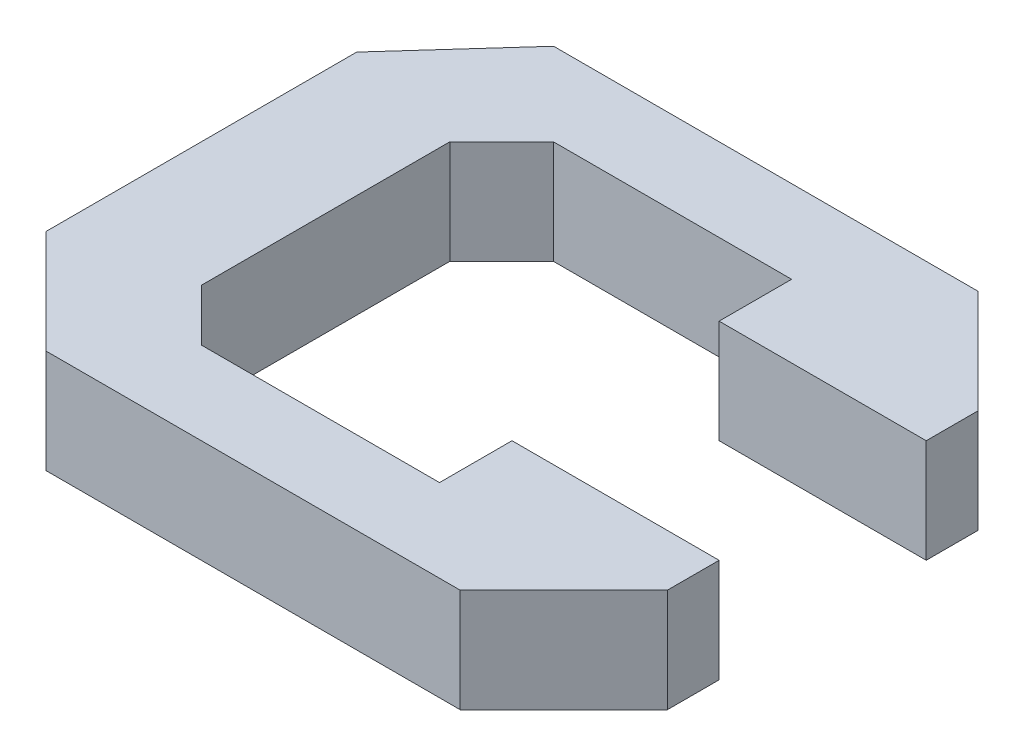
ISO-10303-21;
HEADER;
FILE_DESCRIPTION(('STEP AP214'),'2;1');
FILE_NAME('part.step','',(''),(''),'','','');
FILE_SCHEMA(('AUTOMOTIVE_DESIGN { 1 0 10303 214 1 1 1 1 }'));
ENDSEC;
DATA;
#1=APPLICATION_CONTEXT('core data for automotive mechanical design processes');
#2=APPLICATION_PROTOCOL_DEFINITION('international standard','automotive_design',2000,#1);
#3=PRODUCT_CONTEXT('',#1,'mechanical');
#4=PRODUCT('Part','Part','',(#3));
#5=PRODUCT_RELATED_PRODUCT_CATEGORY('part','',(#4));
#6=PRODUCT_DEFINITION_FORMATION('','',#4);
#7=PRODUCT_DEFINITION_CONTEXT('part definition',#1,'design');
#8=PRODUCT_DEFINITION('design','',#6,#7);
#9=PRODUCT_DEFINITION_SHAPE('','',#8);
#10=(LENGTH_UNIT() NAMED_UNIT(*) SI_UNIT(.MILLI.,.METRE.));
#11=(NAMED_UNIT(*) PLANE_ANGLE_UNIT() SI_UNIT($,.RADIAN.));
#12=(NAMED_UNIT(*) SI_UNIT($,.STERADIAN.) SOLID_ANGLE_UNIT());
#13=UNCERTAINTY_MEASURE_WITH_UNIT(LENGTH_MEASURE(1.E-05),#10,'distance_accuracy_value','');
#14=(GEOMETRIC_REPRESENTATION_CONTEXT(3) GLOBAL_UNCERTAINTY_ASSIGNED_CONTEXT((#13)) GLOBAL_UNIT_ASSIGNED_CONTEXT((#10,
#11,#12)) REPRESENTATION_CONTEXT('',''));
#15=CARTESIAN_POINT('',(0.,0.,0.));
#16=DIRECTION('',(0.,0.,1.));
#17=DIRECTION('',(1.,0.,0.));
#18=AXIS2_PLACEMENT_3D('',#15,#16,#17);
#19=CARTESIAN_POINT('',(0.,6.35,0.));
#20=DIRECTION('',(-1.,0.,0.));
#21=DIRECTION('',(0.,0.,1.));
#22=AXIS2_PLACEMENT_3D('',#19,#20,#21);
#23=PLANE('',#22);
#24=DIRECTION('',(0.,1.,0.));
#25=VECTOR('',#24,1.);
#26=CARTESIAN_POINT('',(0.,0.,-25.4));
#27=LINE('',#26,#25);
#28=CARTESIAN_POINT('',(0.,0.,-25.4));
#29=VERTEX_POINT('',#28);
#30=CARTESIAN_POINT('',(0.,6.35,-25.4));
#31=VERTEX_POINT('',#30);
#32=EDGE_CURVE('E265',#29,#31,#27,.T.);
#33=ORIENTED_EDGE('',*,*,#32,.T.);
#34=DIRECTION('',(0.,0.,-1.));
#35=VECTOR('',#34,1.);
#36=CARTESIAN_POINT('',(0.,6.35,0.));
#37=LINE('',#36,#35);
#38=CARTESIAN_POINT('',(0.,6.35,-22.225));
#39=VERTEX_POINT('',#38);
#40=EDGE_CURVE('E349',#39,#31,#37,.T.);
#41=ORIENTED_EDGE('',*,*,#40,.F.);
#42=DIRECTION('',(0.,1.,0.));
#43=VECTOR('',#42,1.);
#44=CARTESIAN_POINT('',(0.,0.,-22.225));
#45=LINE('',#44,#43);
#46=CARTESIAN_POINT('',(0.,0.,-22.225));
#47=VERTEX_POINT('',#46);
#48=EDGE_CURVE('E335',#47,#39,#45,.T.);
#49=ORIENTED_EDGE('',*,*,#48,.F.);
#50=DIRECTION('',(0.,0.,-1.));
#51=VECTOR('',#50,1.);
#52=CARTESIAN_POINT('',(0.,0.,0.));
#53=LINE('',#52,#51);
#54=EDGE_CURVE('E330',#47,#29,#53,.T.);
#55=ORIENTED_EDGE('',*,*,#54,.T.);
#56=EDGE_LOOP('',(#33,#41,#49,#55));
#57=FACE_BOUND('',#56,.T.);
#58=ADVANCED_FACE('F111',(#57),#23,.F.);
#59=DIRECTION('',(0.,1.,0.));
#60=VECTOR('',#59,1.);
#61=CARTESIAN_POINT('',(0.,0.,-6.35000000000002));
#62=LINE('',#61,#60);
#63=CARTESIAN_POINT('',(0.,0.,-6.35000000000002));
#64=VERTEX_POINT('',#63);
#65=CARTESIAN_POINT('',(0.,6.35,-6.35000000000002));
#66=VERTEX_POINT('',#65);
#67=EDGE_CURVE('E242',#64,#66,#62,.T.);
#68=ORIENTED_EDGE('',*,*,#67,.F.);
#69=CARTESIAN_POINT('',(0.,0.,-9.525));
#70=VERTEX_POINT('',#69);
#71=EDGE_CURVE('E359',#64,#70,#53,.T.);
#72=ORIENTED_EDGE('',*,*,#71,.T.);
#73=DIRECTION('',(0.,1.,0.));
#74=VECTOR('',#73,1.);
#75=CARTESIAN_POINT('',(0.,0.,-9.525));
#76=LINE('',#75,#74);
#77=CARTESIAN_POINT('',(0.,6.35,-9.525));
#78=VERTEX_POINT('',#77);
#79=EDGE_CURVE('E337',#70,#78,#76,.T.);
#80=ORIENTED_EDGE('',*,*,#79,.T.);
#81=EDGE_CURVE('E352',#66,#78,#37,.T.);
#82=ORIENTED_EDGE('',*,*,#81,.F.);
#83=EDGE_LOOP('',(#68,#72,#80,#82));
#84=FACE_BOUND('',#83,.T.);
#85=ADVANCED_FACE('F383',(#84),#23,.F.);
#86=CARTESIAN_POINT('',(0.,6.35,-31.75));
#87=DIRECTION('',(0.,0.,1.));
#88=DIRECTION('',(1.,0.,0.));
#89=AXIS2_PLACEMENT_3D('',#86,#87,#88);
#90=PLANE('',#89);
#91=DIRECTION('',(-1.,0.,0.));
#92=VECTOR('',#91,1.);
#93=CARTESIAN_POINT('',(0.,0.,-31.75));
#94=LINE('',#93,#92);
#95=CARTESIAN_POINT('',(-6.35,0.,-31.75));
#96=VERTEX_POINT('',#95);
#97=CARTESIAN_POINT('',(-32.3716200335261,0.,-31.75));
#98=VERTEX_POINT('',#97);
#99=EDGE_CURVE('E360',#96,#98,#94,.T.);
#100=ORIENTED_EDGE('',*,*,#99,.T.);
#101=DIRECTION('',(0.,1.,0.));
#102=VECTOR('',#101,1.);
#103=CARTESIAN_POINT('',(-32.3716200335261,0.,-31.75));
#104=LINE('',#103,#102);
#105=CARTESIAN_POINT('',(-32.3716200335261,6.35,-31.75));
#106=VERTEX_POINT('',#105);
#107=EDGE_CURVE('E135',#98,#106,#104,.T.);
#108=ORIENTED_EDGE('',*,*,#107,.T.);
#109=DIRECTION('',(-1.,0.,0.));
#110=VECTOR('',#109,1.);
#111=CARTESIAN_POINT('',(0.,6.35,-31.75));
#112=LINE('',#111,#110);
#113=CARTESIAN_POINT('',(-6.35,6.35,-31.75));
#114=VERTEX_POINT('',#113);
#115=EDGE_CURVE('E353',#114,#106,#112,.T.);
#116=ORIENTED_EDGE('',*,*,#115,.F.);
#117=DIRECTION('',(0.,1.,0.));
#118=VECTOR('',#117,1.);
#119=CARTESIAN_POINT('',(-6.35,0.,-31.75));
#120=LINE('',#119,#118);
#121=EDGE_CURVE('E269',#96,#114,#120,.T.);
#122=ORIENTED_EDGE('',*,*,#121,.F.);
#123=EDGE_LOOP('',(#100,#108,#116,#122));
#124=FACE_BOUND('',#123,.T.);
#125=ADVANCED_FACE('F431',(#124),#90,.F.);
#126=CARTESIAN_POINT('',(-38.1,6.35,0.));
#127=DIRECTION('',(1.,0.,0.));
#128=DIRECTION('',(0.,0.,-1.));
#129=AXIS2_PLACEMENT_3D('',#126,#127,#128);
#130=PLANE('',#129);
#131=DIRECTION('',(0.,0.,1.));
#132=VECTOR('',#131,1.);
#133=CARTESIAN_POINT('',(-38.1,6.35,0.));
#134=LINE('',#133,#132);
#135=CARTESIAN_POINT('',(-38.1,6.35,-25.4));
#136=VERTEX_POINT('',#135);
#137=CARTESIAN_POINT('',(-38.1,6.35,-6.35));
#138=VERTEX_POINT('',#137);
#139=EDGE_CURVE('E119',#136,#138,#134,.T.);
#140=ORIENTED_EDGE('',*,*,#139,.F.);
#141=DIRECTION('',(0.,1.,0.));
#142=VECTOR('',#141,1.);
#143=CARTESIAN_POINT('',(-38.1,0.,-25.4));
#144=LINE('',#143,#142);
#145=CARTESIAN_POINT('',(-38.1,0.,-25.4));
#146=VERTEX_POINT('',#145);
#147=EDGE_CURVE('E276',#146,#136,#144,.T.);
#148=ORIENTED_EDGE('',*,*,#147,.F.);
#149=DIRECTION('',(0.,0.,1.));
#150=VECTOR('',#149,1.);
#151=CARTESIAN_POINT('',(-38.1,0.,0.));
#152=LINE('',#151,#150);
#153=CARTESIAN_POINT('',(-38.1,0.,-6.34999999999999));
#154=VERTEX_POINT('',#153);
#155=EDGE_CURVE('E362',#146,#154,#152,.T.);
#156=ORIENTED_EDGE('',*,*,#155,.T.);
#157=DIRECTION('',(0.,1.,0.));
#158=VECTOR('',#157,1.);
#159=CARTESIAN_POINT('',(-38.1,0.,-6.35));
#160=LINE('',#159,#158);
#161=EDGE_CURVE('E282',#154,#138,#160,.T.);
#162=ORIENTED_EDGE('',*,*,#161,.T.);
#163=EDGE_LOOP('',(#140,#148,#156,#162));
#164=FACE_BOUND('',#163,.T.);
#165=ADVANCED_FACE('F367',(#164),#130,.F.);
#166=CARTESIAN_POINT('',(0.,6.35,0.));
#167=DIRECTION('',(0.,0.,-1.));
#168=DIRECTION('',(-1.,0.,0.));
#169=AXIS2_PLACEMENT_3D('',#166,#167,#168);
#170=PLANE('',#169);
#171=DIRECTION('',(0.,1.,0.));
#172=VECTOR('',#171,1.);
#173=CARTESIAN_POINT('',(-31.75,0.,0.));
#174=LINE('',#173,#172);
#175=CARTESIAN_POINT('',(-31.75,0.,0.));
#176=VERTEX_POINT('',#175);
#177=CARTESIAN_POINT('',(-31.75,6.35,0.));
#178=VERTEX_POINT('',#177);
#179=EDGE_CURVE('E271',#176,#178,#174,.T.);
#180=ORIENTED_EDGE('',*,*,#179,.F.);
#181=DIRECTION('',(1.,0.,0.));
#182=VECTOR('',#181,1.);
#183=CARTESIAN_POINT('',(0.,0.,0.));
#184=LINE('',#183,#182);
#185=CARTESIAN_POINT('',(-6.35,0.,0.));
#186=VERTEX_POINT('',#185);
#187=EDGE_CURVE('E114',#176,#186,#184,.T.);
#188=ORIENTED_EDGE('',*,*,#187,.T.);
#189=DIRECTION('',(0.,1.,0.));
#190=VECTOR('',#189,1.);
#191=CARTESIAN_POINT('',(-6.35,0.,0.));
#192=LINE('',#191,#190);
#193=CARTESIAN_POINT('',(-6.35,6.35,0.));
#194=VERTEX_POINT('',#193);
#195=EDGE_CURVE('E239',#186,#194,#192,.T.);
#196=ORIENTED_EDGE('',*,*,#195,.T.);
#197=DIRECTION('',(1.,0.,0.));
#198=VECTOR('',#197,1.);
#199=CARTESIAN_POINT('',(0.,6.35,0.));
#200=LINE('',#199,#198);
#201=EDGE_CURVE('E12',#178,#194,#200,.T.);
#202=ORIENTED_EDGE('',*,*,#201,.F.);
#203=EDGE_LOOP('',(#180,#188,#196,#202));
#204=FACE_BOUND('',#203,.T.);
#205=ADVANCED_FACE('F253',(#204),#170,.F.);
#206=CARTESIAN_POINT('',(0.,6.35,0.));
#207=DIRECTION('',(0.,1.,0.));
#208=DIRECTION('',(0.,0.,1.));
#209=AXIS2_PLACEMENT_3D('',#206,#207,#208);
#210=PLANE('',#209);
#211=DIRECTION('',(0.669828666550268,0.,-0.74251569509842));
#212=VECTOR('',#211,1.);
#213=CARTESIAN_POINT('',(-38.1,6.35,-25.4));
#214=LINE('',#213,#212);
#215=EDGE_CURVE('E280',#136,#106,#214,.T.);
#216=ORIENTED_EDGE('',*,*,#215,.F.);
#217=ORIENTED_EDGE('',*,*,#139,.T.);
#218=DIRECTION('',(0.707106781186547,0.,0.707106781186547));
#219=VECTOR('',#218,1.);
#220=CARTESIAN_POINT('',(-38.1,6.35,-6.35));
#221=LINE('',#220,#219);
#222=EDGE_CURVE('E261',#138,#178,#221,.T.);
#223=ORIENTED_EDGE('',*,*,#222,.T.);
#224=ORIENTED_EDGE('',*,*,#201,.T.);
#225=DIRECTION('',(0.707106781186546,0.,-0.707106781186549));
#226=VECTOR('',#225,1.);
#227=CARTESIAN_POINT('',(-6.35,6.35,0.));
#228=LINE('',#227,#226);
#229=EDGE_CURVE('E236',#194,#66,#228,.T.);
#230=ORIENTED_EDGE('',*,*,#229,.T.);
#231=ORIENTED_EDGE('',*,*,#81,.T.);
#232=DIRECTION('',(1.,0.,0.));
#233=VECTOR('',#232,1.);
#234=CARTESIAN_POINT('',(0.,6.35,-9.525));
#235=LINE('',#234,#233);
#236=CARTESIAN_POINT('',(-12.7,6.35,-9.525));
#237=VERTEX_POINT('',#236);
#238=EDGE_CURVE('E319',#237,#78,#235,.T.);
#239=ORIENTED_EDGE('',*,*,#238,.F.);
#240=DIRECTION('',(0.,0.,1.));
#241=VECTOR('',#240,1.);
#242=CARTESIAN_POINT('',(-12.7,6.35,0.));
#243=LINE('',#242,#241);
#244=CARTESIAN_POINT('',(-12.7,6.35,-5.08));
#245=VERTEX_POINT('',#244);
#246=EDGE_CURVE('E316',#237,#245,#243,.T.);
#247=ORIENTED_EDGE('',*,*,#246,.T.);
#248=DIRECTION('',(1.,0.,0.));
#249=VECTOR('',#248,1.);
#250=CARTESIAN_POINT('',(0.,6.35,-5.08));
#251=LINE('',#250,#249);
#252=CARTESIAN_POINT('',(-27.305,6.35,-5.08));
#253=VERTEX_POINT('',#252);
#254=EDGE_CURVE('E313',#253,#245,#251,.T.);
#255=ORIENTED_EDGE('',*,*,#254,.F.);
#256=DIRECTION('',(0.70710678118655,0.,0.707106781186545));
#257=VECTOR('',#256,1.);
#258=CARTESIAN_POINT('',(-11.1124999999999,6.35,11.1125));
#259=LINE('',#258,#257);
#260=CARTESIAN_POINT('',(-30.48,6.35,-8.255));
#261=VERTEX_POINT('',#260);
#262=EDGE_CURVE('E310',#261,#253,#259,.T.);
#263=ORIENTED_EDGE('',*,*,#262,.F.);
#264=DIRECTION('',(0.,0.,1.));
#265=VECTOR('',#264,1.);
#266=CARTESIAN_POINT('',(-30.48,6.35,0.));
#267=LINE('',#266,#265);
#268=CARTESIAN_POINT('',(-30.48,6.35,-23.495));
#269=VERTEX_POINT('',#268);
#270=EDGE_CURVE('E307',#269,#261,#267,.T.);
#271=ORIENTED_EDGE('',*,*,#270,.F.);
#272=DIRECTION('',(0.707106781186544,0.,-0.707106781186551));
#273=VECTOR('',#272,1.);
#274=CARTESIAN_POINT('',(-26.9875000000002,6.35,-26.9874999999999));
#275=LINE('',#274,#273);
#276=CARTESIAN_POINT('',(-27.305,6.35,-26.67));
#277=VERTEX_POINT('',#276);
#278=EDGE_CURVE('E246',#269,#277,#275,.T.);
#279=ORIENTED_EDGE('',*,*,#278,.T.);
#280=DIRECTION('',(1.,0.,0.));
#281=VECTOR('',#280,1.);
#282=CARTESIAN_POINT('',(0.,6.35,-26.67));
#283=LINE('',#282,#281);
#284=CARTESIAN_POINT('',(-12.7,6.35,-26.67));
#285=VERTEX_POINT('',#284);
#286=EDGE_CURVE('E287',#277,#285,#283,.T.);
#287=ORIENTED_EDGE('',*,*,#286,.T.);
#288=CARTESIAN_POINT('',(-12.7,6.35,-22.225));
#289=VERTEX_POINT('',#288);
#290=EDGE_CURVE('E320',#285,#289,#243,.T.);
#291=ORIENTED_EDGE('',*,*,#290,.T.);
#292=DIRECTION('',(1.,0.,0.));
#293=VECTOR('',#292,1.);
#294=CARTESIAN_POINT('',(0.,6.35,-22.225));
#295=LINE('',#294,#293);
#296=EDGE_CURVE('E322',#289,#39,#295,.T.);
#297=ORIENTED_EDGE('',*,*,#296,.T.);
#298=ORIENTED_EDGE('',*,*,#40,.T.);
#299=DIRECTION('',(-0.707106781186546,0.,-0.707106781186549));
#300=VECTOR('',#299,1.);
#301=CARTESIAN_POINT('',(0.,6.35,-25.4));
#302=LINE('',#301,#300);
#303=EDGE_CURVE('E255',#31,#114,#302,.T.);
#304=ORIENTED_EDGE('',*,*,#303,.T.);
#305=ORIENTED_EDGE('',*,*,#115,.T.);
#306=EDGE_LOOP('',(#216,#217,#223,#224,#230,#231,#239,#247,#255,#263,#271,#279,#287,#291,#297,
#298,#304,#305));
#307=FACE_BOUND('',#306,.T.);
#308=ADVANCED_FACE('F259',(#307),#210,.T.);
#309=CARTESIAN_POINT('',(0.,0.,0.));
#310=DIRECTION('',(0.,1.,0.));
#311=DIRECTION('',(0.,0.,1.));
#312=AXIS2_PLACEMENT_3D('',#309,#310,#311);
#313=PLANE('',#312);
#314=ORIENTED_EDGE('',*,*,#155,.F.);
#315=DIRECTION('',(0.669828666550268,0.,-0.74251569509842));
#316=VECTOR('',#315,1.);
#317=CARTESIAN_POINT('',(-38.1,0.,-25.4));
#318=LINE('',#317,#316);
#319=EDGE_CURVE('E278',#146,#98,#318,.T.);
#320=ORIENTED_EDGE('',*,*,#319,.T.);
#321=ORIENTED_EDGE('',*,*,#99,.F.);
#322=DIRECTION('',(-0.707106781186546,0.,-0.707106781186549));
#323=VECTOR('',#322,1.);
#324=CARTESIAN_POINT('',(0.,0.,-25.4));
#325=LINE('',#324,#323);
#326=EDGE_CURVE('E374',#29,#96,#325,.T.);
#327=ORIENTED_EDGE('',*,*,#326,.F.);
#328=ORIENTED_EDGE('',*,*,#54,.F.);
#329=DIRECTION('',(1.,0.,0.));
#330=VECTOR('',#329,1.);
#331=CARTESIAN_POINT('',(0.,0.,-22.225));
#332=LINE('',#331,#330);
#333=CARTESIAN_POINT('',(-12.7,0.,-22.225));
#334=VERTEX_POINT('',#333);
#335=EDGE_CURVE('E300',#334,#47,#332,.T.);
#336=ORIENTED_EDGE('',*,*,#335,.F.);
#337=DIRECTION('',(0.,0.,1.));
#338=VECTOR('',#337,1.);
#339=CARTESIAN_POINT('',(-12.7,0.,0.));
#340=LINE('',#339,#338);
#341=CARTESIAN_POINT('',(-12.7,0.,-26.67));
#342=VERTEX_POINT('',#341);
#343=EDGE_CURVE('E297',#342,#334,#340,.T.);
#344=ORIENTED_EDGE('',*,*,#343,.F.);
#345=DIRECTION('',(1.,0.,0.));
#346=VECTOR('',#345,1.);
#347=CARTESIAN_POINT('',(0.,0.,-26.67));
#348=LINE('',#347,#346);
#349=CARTESIAN_POINT('',(-27.305,0.,-26.67));
#350=VERTEX_POINT('',#349);
#351=EDGE_CURVE('E302',#350,#342,#348,.T.);
#352=ORIENTED_EDGE('',*,*,#351,.F.);
#353=DIRECTION('',(0.707106781186544,0.,-0.707106781186551));
#354=VECTOR('',#353,1.);
#355=CARTESIAN_POINT('',(-26.9875000000002,0.,-26.9874999999999));
#356=LINE('',#355,#354);
#357=CARTESIAN_POINT('',(-30.48,0.,-23.495));
#358=VERTEX_POINT('',#357);
#359=EDGE_CURVE('E284',#358,#350,#356,.T.);
#360=ORIENTED_EDGE('',*,*,#359,.F.);
#361=DIRECTION('',(0.,0.,1.));
#362=VECTOR('',#361,1.);
#363=CARTESIAN_POINT('',(-30.48,0.,0.));
#364=LINE('',#363,#362);
#365=CARTESIAN_POINT('',(-30.48,0.,-8.255));
#366=VERTEX_POINT('',#365);
#367=EDGE_CURVE('E286',#358,#366,#364,.T.);
#368=ORIENTED_EDGE('',*,*,#367,.T.);
#369=DIRECTION('',(0.70710678118655,0.,0.707106781186545));
#370=VECTOR('',#369,1.);
#371=CARTESIAN_POINT('',(-11.1124999999999,0.,11.1125));
#372=LINE('',#371,#370);
#373=CARTESIAN_POINT('',(-27.305,0.,-5.08));
#374=VERTEX_POINT('',#373);
#375=EDGE_CURVE('E127',#366,#374,#372,.T.);
#376=ORIENTED_EDGE('',*,*,#375,.T.);
#377=DIRECTION('',(1.,0.,0.));
#378=VECTOR('',#377,1.);
#379=CARTESIAN_POINT('',(0.,0.,-5.08));
#380=LINE('',#379,#378);
#381=CARTESIAN_POINT('',(-12.7,0.,-5.08));
#382=VERTEX_POINT('',#381);
#383=EDGE_CURVE('E291',#374,#382,#380,.T.);
#384=ORIENTED_EDGE('',*,*,#383,.T.);
#385=CARTESIAN_POINT('',(-12.7,0.,-9.525));
#386=VERTEX_POINT('',#385);
#387=EDGE_CURVE('E294',#386,#382,#340,.T.);
#388=ORIENTED_EDGE('',*,*,#387,.F.);
#389=DIRECTION('',(1.,0.,0.));
#390=VECTOR('',#389,1.);
#391=CARTESIAN_POINT('',(0.,0.,-9.525));
#392=LINE('',#391,#390);
#393=EDGE_CURVE('E296',#386,#70,#392,.T.);
#394=ORIENTED_EDGE('',*,*,#393,.T.);
#395=ORIENTED_EDGE('',*,*,#71,.F.);
#396=DIRECTION('',(0.707106781186546,0.,-0.707106781186549));
#397=VECTOR('',#396,1.);
#398=CARTESIAN_POINT('',(-6.35,0.,0.));
#399=LINE('',#398,#397);
#400=EDGE_CURVE('E247',#186,#64,#399,.T.);
#401=ORIENTED_EDGE('',*,*,#400,.F.);
#402=ORIENTED_EDGE('',*,*,#187,.F.);
#403=DIRECTION('',(0.707106781186547,0.,0.707106781186547));
#404=VECTOR('',#403,1.);
#405=CARTESIAN_POINT('',(-38.1,0.,-6.35));
#406=LINE('',#405,#404);
#407=EDGE_CURVE('E266',#154,#176,#406,.T.);
#408=ORIENTED_EDGE('',*,*,#407,.F.);
#409=EDGE_LOOP('',(#314,#320,#321,#327,#328,#336,#344,#352,#360,#368,#376,#384,#388,#394,#395,
#401,#402,#408));
#410=FACE_BOUND('',#409,.T.);
#411=ADVANCED_FACE('F370',(#410),#313,.F.);
#412=CARTESIAN_POINT('',(-26.9875000000002,0.,-26.9874999999999));
#413=DIRECTION('',(0.707106781186551,0.,0.707106781186544));
#414=DIRECTION('',(0.707106781186544,0.,-0.707106781186551));
#415=AXIS2_PLACEMENT_3D('',#412,#413,#414);
#416=PLANE('',#415);
#417=ORIENTED_EDGE('',*,*,#278,.F.);
#418=DIRECTION('',(0.,1.,0.));
#419=VECTOR('',#418,1.);
#420=CARTESIAN_POINT('',(-30.48,0.,-23.495));
#421=LINE('',#420,#419);
#422=EDGE_CURVE('E304',#358,#269,#421,.T.);
#423=ORIENTED_EDGE('',*,*,#422,.F.);
#424=ORIENTED_EDGE('',*,*,#359,.T.);
#425=DIRECTION('',(0.,1.,0.));
#426=VECTOR('',#425,1.);
#427=CARTESIAN_POINT('',(-27.305,0.,-26.67));
#428=LINE('',#427,#426);
#429=EDGE_CURVE('E327',#350,#277,#428,.T.);
#430=ORIENTED_EDGE('',*,*,#429,.T.);
#431=EDGE_LOOP('',(#417,#423,#424,#430));
#432=FACE_BOUND('',#431,.T.);
#433=ADVANCED_FACE('F406',(#432),#416,.T.);
#434=CARTESIAN_POINT('',(0.,0.,-26.67));
#435=DIRECTION('',(0.,0.,1.));
#436=DIRECTION('',(1.,0.,0.));
#437=AXIS2_PLACEMENT_3D('',#434,#435,#436);
#438=PLANE('',#437);
#439=ORIENTED_EDGE('',*,*,#286,.F.);
#440=ORIENTED_EDGE('',*,*,#429,.F.);
#441=ORIENTED_EDGE('',*,*,#351,.T.);
#442=DIRECTION('',(0.,1.,0.));
#443=VECTOR('',#442,1.);
#444=CARTESIAN_POINT('',(-12.7,0.,-26.67));
#445=LINE('',#444,#443);
#446=EDGE_CURVE('E331',#342,#285,#445,.T.);
#447=ORIENTED_EDGE('',*,*,#446,.T.);
#448=EDGE_LOOP('',(#439,#440,#441,#447));
#449=FACE_BOUND('',#448,.T.);
#450=ADVANCED_FACE('F410',(#449),#438,.T.);
#451=CARTESIAN_POINT('',(-12.7,0.,0.));
#452=DIRECTION('',(-1.,0.,0.));
#453=DIRECTION('',(0.,0.,1.));
#454=AXIS2_PLACEMENT_3D('',#451,#452,#453);
#455=PLANE('',#454);
#456=ORIENTED_EDGE('',*,*,#290,.F.);
#457=ORIENTED_EDGE('',*,*,#446,.F.);
#458=ORIENTED_EDGE('',*,*,#343,.T.);
#459=DIRECTION('',(0.,1.,0.));
#460=VECTOR('',#459,1.);
#461=CARTESIAN_POINT('',(-12.7,0.,-22.225));
#462=LINE('',#461,#460);
#463=EDGE_CURVE('E333',#334,#289,#462,.T.);
#464=ORIENTED_EDGE('',*,*,#463,.T.);
#465=EDGE_LOOP('',(#456,#457,#458,#464));
#466=FACE_BOUND('',#465,.T.);
#467=ADVANCED_FACE('F418',(#466),#455,.T.);
#468=CARTESIAN_POINT('',(0.,0.,-22.225));
#469=DIRECTION('',(0.,0.,1.));
#470=DIRECTION('',(1.,0.,0.));
#471=AXIS2_PLACEMENT_3D('',#468,#469,#470);
#472=PLANE('',#471);
#473=ORIENTED_EDGE('',*,*,#296,.F.);
#474=ORIENTED_EDGE('',*,*,#463,.F.);
#475=ORIENTED_EDGE('',*,*,#335,.T.);
#476=ORIENTED_EDGE('',*,*,#48,.T.);
#477=EDGE_LOOP('',(#473,#474,#475,#476));
#478=FACE_BOUND('',#477,.T.);
#479=ADVANCED_FACE('F421',(#478),#472,.T.);
#480=CARTESIAN_POINT('',(0.,0.,-9.525));
#481=DIRECTION('',(0.,0.,1.));
#482=DIRECTION('',(1.,0.,0.));
#483=AXIS2_PLACEMENT_3D('',#480,#481,#482);
#484=PLANE('',#483);
#485=ORIENTED_EDGE('',*,*,#238,.T.);
#486=ORIENTED_EDGE('',*,*,#79,.F.);
#487=ORIENTED_EDGE('',*,*,#393,.F.);
#488=DIRECTION('',(0.,1.,0.));
#489=VECTOR('',#488,1.);
#490=CARTESIAN_POINT('',(-12.7,0.,-9.525));
#491=LINE('',#490,#489);
#492=EDGE_CURVE('E340',#386,#237,#491,.T.);
#493=ORIENTED_EDGE('',*,*,#492,.T.);
#494=EDGE_LOOP('',(#485,#486,#487,#493));
#495=FACE_BOUND('',#494,.T.);
#496=ADVANCED_FACE('F387',(#495),#484,.F.);
#497=ORIENTED_EDGE('',*,*,#246,.F.);
#498=ORIENTED_EDGE('',*,*,#492,.F.);
#499=ORIENTED_EDGE('',*,*,#387,.T.);
#500=DIRECTION('',(0.,1.,0.));
#501=VECTOR('',#500,1.);
#502=CARTESIAN_POINT('',(-12.7,0.,-5.08));
#503=LINE('',#502,#501);
#504=EDGE_CURVE('E342',#382,#245,#503,.T.);
#505=ORIENTED_EDGE('',*,*,#504,.T.);
#506=EDGE_LOOP('',(#497,#498,#499,#505));
#507=FACE_BOUND('',#506,.T.);
#508=ADVANCED_FACE('F393',(#507),#455,.T.);
#509=CARTESIAN_POINT('',(0.,0.,-5.08));
#510=DIRECTION('',(0.,0.,1.));
#511=DIRECTION('',(1.,0.,0.));
#512=AXIS2_PLACEMENT_3D('',#509,#510,#511);
#513=PLANE('',#512);
#514=ORIENTED_EDGE('',*,*,#254,.T.);
#515=ORIENTED_EDGE('',*,*,#504,.F.);
#516=ORIENTED_EDGE('',*,*,#383,.F.);
#517=DIRECTION('',(0.,1.,0.));
#518=VECTOR('',#517,1.);
#519=CARTESIAN_POINT('',(-27.305,0.,-5.08));
#520=LINE('',#519,#518);
#521=EDGE_CURVE('E344',#374,#253,#520,.T.);
#522=ORIENTED_EDGE('',*,*,#521,.T.);
#523=EDGE_LOOP('',(#514,#515,#516,#522));
#524=FACE_BOUND('',#523,.T.);
#525=ADVANCED_FACE('F397',(#524),#513,.F.);
#526=CARTESIAN_POINT('',(-11.1124999999999,0.,11.1125));
#527=DIRECTION('',(-0.707106781186545,0.,0.70710678118655));
#528=DIRECTION('',(0.70710678118655,0.,0.707106781186545));
#529=AXIS2_PLACEMENT_3D('',#526,#527,#528);
#530=PLANE('',#529);
#531=ORIENTED_EDGE('',*,*,#262,.T.);
#532=ORIENTED_EDGE('',*,*,#521,.F.);
#533=ORIENTED_EDGE('',*,*,#375,.F.);
#534=DIRECTION('',(0.,1.,0.));
#535=VECTOR('',#534,1.);
#536=CARTESIAN_POINT('',(-30.48,0.,-8.255));
#537=LINE('',#536,#535);
#538=EDGE_CURVE('E346',#366,#261,#537,.T.);
#539=ORIENTED_EDGE('',*,*,#538,.T.);
#540=EDGE_LOOP('',(#531,#532,#533,#539));
#541=FACE_BOUND('',#540,.T.);
#542=ADVANCED_FACE('F398',(#541),#530,.F.);
#543=CARTESIAN_POINT('',(-30.48,0.,0.));
#544=DIRECTION('',(-1.,0.,0.));
#545=DIRECTION('',(0.,0.,1.));
#546=AXIS2_PLACEMENT_3D('',#543,#544,#545);
#547=PLANE('',#546);
#548=ORIENTED_EDGE('',*,*,#270,.T.);
#549=ORIENTED_EDGE('',*,*,#538,.F.);
#550=ORIENTED_EDGE('',*,*,#367,.F.);
#551=ORIENTED_EDGE('',*,*,#422,.T.);
#552=EDGE_LOOP('',(#548,#549,#550,#551));
#553=FACE_BOUND('',#552,.T.);
#554=ADVANCED_FACE('F402',(#553),#547,.F.);
#555=CARTESIAN_POINT('',(-6.35,0.,0.));
#556=DIRECTION('',(0.707106781186549,0.,0.707106781186546));
#557=DIRECTION('',(0.707106781186546,0.,-0.707106781186549));
#558=AXIS2_PLACEMENT_3D('',#555,#556,#557);
#559=PLANE('',#558);
#560=ORIENTED_EDGE('',*,*,#229,.F.);
#561=ORIENTED_EDGE('',*,*,#195,.F.);
#562=ORIENTED_EDGE('',*,*,#400,.T.);
#563=ORIENTED_EDGE('',*,*,#67,.T.);
#564=EDGE_LOOP('',(#560,#561,#562,#563));
#565=FACE_BOUND('',#564,.T.);
#566=ADVANCED_FACE('F238',(#565),#559,.T.);
#567=CARTESIAN_POINT('',(0.,0.,-25.4));
#568=DIRECTION('',(0.707106781186549,0.,-0.707106781186546));
#569=DIRECTION('',(-0.707106781186546,0.,-0.707106781186549));
#570=AXIS2_PLACEMENT_3D('',#567,#568,#569);
#571=PLANE('',#570);
#572=ORIENTED_EDGE('',*,*,#303,.F.);
#573=ORIENTED_EDGE('',*,*,#32,.F.);
#574=ORIENTED_EDGE('',*,*,#326,.T.);
#575=ORIENTED_EDGE('',*,*,#121,.T.);
#576=EDGE_LOOP('',(#572,#573,#574,#575));
#577=FACE_BOUND('',#576,.T.);
#578=ADVANCED_FACE('F428',(#577),#571,.T.);
#579=CARTESIAN_POINT('',(-38.1,0.,-6.35));
#580=DIRECTION('',(-0.707106781186548,0.,0.707106781186548));
#581=DIRECTION('',(0.707106781186548,0.,0.707106781186548));
#582=AXIS2_PLACEMENT_3D('',#579,#580,#581);
#583=PLANE('',#582);
#584=ORIENTED_EDGE('',*,*,#222,.F.);
#585=ORIENTED_EDGE('',*,*,#161,.F.);
#586=ORIENTED_EDGE('',*,*,#407,.T.);
#587=ORIENTED_EDGE('',*,*,#179,.T.);
#588=EDGE_LOOP('',(#584,#585,#586,#587));
#589=FACE_BOUND('',#588,.T.);
#590=ADVANCED_FACE('F372',(#589),#583,.T.);
#591=CARTESIAN_POINT('',(-38.1,0.,-25.4));
#592=DIRECTION('',(0.74251569509842,0.,0.669828666550268));
#593=DIRECTION('',(0.669828666550268,0.,-0.74251569509842));
#594=AXIS2_PLACEMENT_3D('',#591,#592,#593);
#595=PLANE('',#594);
#596=ORIENTED_EDGE('',*,*,#215,.T.);
#597=ORIENTED_EDGE('',*,*,#107,.F.);
#598=ORIENTED_EDGE('',*,*,#319,.F.);
#599=ORIENTED_EDGE('',*,*,#147,.T.);
#600=EDGE_LOOP('',(#596,#597,#598,#599));
#601=FACE_BOUND('',#600,.T.);
#602=ADVANCED_FACE('F433',(#601),#595,.F.);
#603=CLOSED_SHELL('',(#58,#85,#125,#165,#205,#308,#411,#433,#450,#467,#479,#496,#508,#525,#542,
#554,#566,#578,#590,#602));
#604=MANIFOLD_SOLID_BREP('B2',#603);
#605=ADVANCED_BREP_SHAPE_REPRESENTATION('',(#18,#604),#14);
#606=SHAPE_DEFINITION_REPRESENTATION(#9,#605);
ENDSEC;
END-ISO-10303-21;
